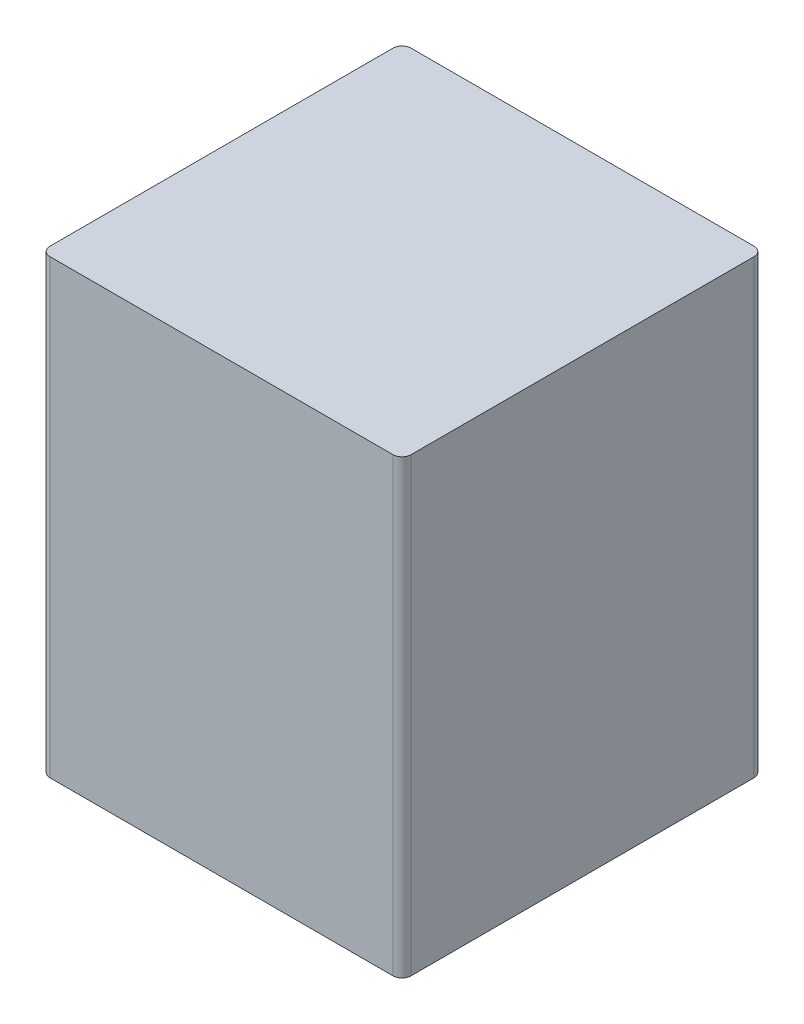
ISO-10303-21;
HEADER;
FILE_DESCRIPTION(('STEP AP214'),'2;1');
FILE_NAME('part.step','',(''),(''),'','','');
FILE_SCHEMA(('AUTOMOTIVE_DESIGN { 1 0 10303 214 1 1 1 1 }'));
ENDSEC;
DATA;
#1=APPLICATION_CONTEXT('core data for automotive mechanical design processes');
#2=APPLICATION_PROTOCOL_DEFINITION('international standard','automotive_design',2000,#1);
#3=PRODUCT_CONTEXT('',#1,'mechanical');
#4=PRODUCT('Part','Part','',(#3));
#5=PRODUCT_RELATED_PRODUCT_CATEGORY('part','',(#4));
#6=PRODUCT_DEFINITION_FORMATION('','',#4);
#7=PRODUCT_DEFINITION_CONTEXT('part definition',#1,'design');
#8=PRODUCT_DEFINITION('design','',#6,#7);
#9=PRODUCT_DEFINITION_SHAPE('','',#8);
#10=(LENGTH_UNIT() NAMED_UNIT(*) SI_UNIT(.MILLI.,.METRE.));
#11=(NAMED_UNIT(*) PLANE_ANGLE_UNIT() SI_UNIT($,.RADIAN.));
#12=(NAMED_UNIT(*) SI_UNIT($,.STERADIAN.) SOLID_ANGLE_UNIT());
#13=UNCERTAINTY_MEASURE_WITH_UNIT(LENGTH_MEASURE(1.E-05),#10,'distance_accuracy_value','');
#14=(GEOMETRIC_REPRESENTATION_CONTEXT(3) GLOBAL_UNCERTAINTY_ASSIGNED_CONTEXT((#13)) GLOBAL_UNIT_ASSIGNED_CONTEXT((#10,
#11,#12)) REPRESENTATION_CONTEXT('',''));
#15=CARTESIAN_POINT('',(0.,0.,0.));
#16=DIRECTION('',(0.,0.,1.));
#17=DIRECTION('',(1.,0.,0.));
#18=AXIS2_PLACEMENT_3D('',#15,#16,#17);
#19=CARTESIAN_POINT('',(11.4142330001026,68.8538549999221,-0.0200000060000001));
#20=DIRECTION('',(-2.05103367282991E-10,1.,0.));
#21=DIRECTION('',(-1.,-2.05103367282991E-10,0.));
#22=AXIS2_PLACEMENT_3D('',#19,#20,#21);
#23=CYLINDRICAL_SURFACE('',#22,0.02);
#24=CARTESIAN_POINT('',(11.4142329998975,69.8538549999221,-0.0200000060000001));
#25=DIRECTION('',(-2.05103367282991E-10,1.,0.));
#26=DIRECTION('',(-1.,-2.05103367282991E-10,0.));
#27=AXIS2_PLACEMENT_3D('',#24,#25,#26);
#28=CIRCLE('',#27,0.02);
#29=CARTESIAN_POINT('',(11.414233,69.8538549999221,-6.00000000643917E-09));
#30=VERTEX_POINT('',#29);
#31=CARTESIAN_POINT('',(11.3942329998974,69.853854999918,-0.0200000060000001));
#32=VERTEX_POINT('',#31);
#33=EDGE_CURVE('E113',#30,#32,#28,.F.);
#34=ORIENTED_EDGE('',*,*,#33,.T.);
#35=DIRECTION('',(-2.05103367282991E-10,1.,0.));
#36=VECTOR('',#35,1.);
#37=CARTESIAN_POINT('',(11.3942330001026,68.853854999918,-0.0200000060000001));
#38=LINE('',#37,#36);
#39=CARTESIAN_POINT('',(11.3942330001026,68.853854999918,-0.0200000060000001));
#40=VERTEX_POINT('',#39);
#41=EDGE_CURVE('E117',#32,#40,#38,.F.);
#42=ORIENTED_EDGE('',*,*,#41,.T.);
#43=CARTESIAN_POINT('',(11.4142330001026,68.8538549999221,-0.0200000060000001));
#44=DIRECTION('',(-2.05103367282991E-10,1.,0.));
#45=DIRECTION('',(-1.,-2.05103367282991E-10,0.));
#46=AXIS2_PLACEMENT_3D('',#43,#44,#45);
#47=CIRCLE('',#46,0.02);
#48=CARTESIAN_POINT('',(11.4142330001026,68.8538549999221,-6.00000007254734E-09));
#49=VERTEX_POINT('',#48);
#50=EDGE_CURVE('E127',#40,#49,#47,.T.);
#51=ORIENTED_EDGE('',*,*,#50,.T.);
#52=DIRECTION('',(0.,1.,0.));
#53=VECTOR('',#52,1.);
#54=CARTESIAN_POINT('',(11.4142330001026,68.853855000082,-6.00000003685316E-09));
#55=LINE('',#54,#53);
#56=EDGE_CURVE('E123',#49,#30,#55,.T.);
#57=ORIENTED_EDGE('',*,*,#56,.T.);
#58=EDGE_LOOP('',(#34,#42,#51,#57));
#59=FACE_BOUND('',#58,.T.);
#60=ADVANCED_FACE('F17',(#59),#23,.T.);
#61=CARTESIAN_POINT('',(12.1942330001026,68.853855000082,-5.99999994133071E-09));
#62=DIRECTION('',(0.,0.,-1.));
#63=DIRECTION('',(-1.,0.,0.));
#64=AXIS2_PLACEMENT_3D('',#61,#62,#63);
#65=PLANE('',#64);
#66=DIRECTION('',(2.05103367282991E-10,-1.,0.));
#67=VECTOR('',#66,1.);
#68=CARTESIAN_POINT('',(12.1742329998974,69.8538550000779,-5.99999999974211E-09));
#69=LINE('',#68,#67);
#70=CARTESIAN_POINT('',(12.1742329998974,69.8538550000779,-5.99999999381288E-09));
#71=VERTEX_POINT('',#70);
#72=CARTESIAN_POINT('',(12.1742330001025,68.8538550000779,-6.00000004209375E-09));
#73=VERTEX_POINT('',#72);
#74=EDGE_CURVE('E88',#71,#73,#69,.T.);
#75=ORIENTED_EDGE('',*,*,#74,.F.);
#76=DIRECTION('',(1.,2.05103367282991E-10,0.));
#77=VECTOR('',#76,1.);
#78=CARTESIAN_POINT('',(11.3942329998974,69.853854999918,-5.99999997602518E-09));
#79=LINE('',#78,#77);
#80=EDGE_CURVE('E85',#71,#30,#79,.F.);
#81=ORIENTED_EDGE('',*,*,#80,.T.);
#82=ORIENTED_EDGE('',*,*,#56,.F.);
#83=DIRECTION('',(-1.,-2.05103367282991E-10,0.));
#84=VECTOR('',#83,1.);
#85=CARTESIAN_POINT('',(12.1942330001026,68.853855000082,-6.0000000844454E-09));
#86=LINE('',#85,#84);
#87=EDGE_CURVE('E135',#49,#73,#86,.F.);
#88=ORIENTED_EDGE('',*,*,#87,.T.);
#89=EDGE_LOOP('',(#75,#81,#82,#88));
#90=FACE_BOUND('',#89,.T.);
#91=ADVANCED_FACE('F145',(#90),#65,.F.);
#92=CARTESIAN_POINT('',(12.1942330001026,68.853855000082,-0.800000006));
#93=DIRECTION('',(0.,0.,-1.));
#94=DIRECTION('',(-1.,0.,0.));
#95=AXIS2_PLACEMENT_3D('',#92,#93,#94);
#96=PLANE('',#95);
#97=DIRECTION('',(1.,2.05103367282991E-10,0.));
#98=VECTOR('',#97,1.);
#99=CARTESIAN_POINT('',(11.3942329998974,69.853854999918,-0.800000006));
#100=LINE('',#99,#98);
#101=CARTESIAN_POINT('',(11.4142329998974,69.8538549999221,-0.800000006));
#102=VERTEX_POINT('',#101);
#103=CARTESIAN_POINT('',(12.1742329998975,69.8538550000779,-0.800000006));
#104=VERTEX_POINT('',#103);
#105=EDGE_CURVE('E106',#102,#104,#100,.T.);
#106=ORIENTED_EDGE('',*,*,#105,.T.);
#107=DIRECTION('',(-2.05103367282991E-10,1.,0.));
#108=VECTOR('',#107,1.);
#109=CARTESIAN_POINT('',(12.1742330001026,68.8538550000779,-0.800000006));
#110=LINE('',#109,#108);
#111=CARTESIAN_POINT('',(12.1742330001026,68.8538550000779,-0.800000006));
#112=VERTEX_POINT('',#111);
#113=EDGE_CURVE('E124',#112,#104,#110,.T.);
#114=ORIENTED_EDGE('',*,*,#113,.F.);
#115=DIRECTION('',(-1.,-2.05103367282991E-10,0.));
#116=VECTOR('',#115,1.);
#117=CARTESIAN_POINT('',(12.1942330001026,68.853855000082,-0.800000006));
#118=LINE('',#117,#116);
#119=CARTESIAN_POINT('',(11.4142330001026,68.8538549999221,-0.800000006));
#120=VERTEX_POINT('',#119);
#121=EDGE_CURVE('E132',#112,#120,#118,.T.);
#122=ORIENTED_EDGE('',*,*,#121,.T.);
#123=DIRECTION('',(2.05103367282991E-10,-1.,0.));
#124=VECTOR('',#123,1.);
#125=CARTESIAN_POINT('',(11.4142330001025,68.8538549999221,-0.800000006));
#126=LINE('',#125,#124);
#127=EDGE_CURVE('E120',#102,#120,#126,.T.);
#128=ORIENTED_EDGE('',*,*,#127,.F.);
#129=EDGE_LOOP('',(#106,#114,#122,#128));
#130=FACE_BOUND('',#129,.T.);
#131=ADVANCED_FACE('F156',(#130),#96,.T.);
#132=CARTESIAN_POINT('',(11.4142330001026,68.8538549999221,-0.780000006));
#133=DIRECTION('',(2.05103367282991E-10,-1.,0.));
#134=DIRECTION('',(1.,2.05103367282991E-10,0.));
#135=AXIS2_PLACEMENT_3D('',#132,#133,#134);
#136=CYLINDRICAL_SURFACE('',#135,0.02);
#137=CARTESIAN_POINT('',(11.4142329998975,69.8538549999221,-0.780000006));
#138=DIRECTION('',(2.05103367282991E-10,-1.,0.));
#139=DIRECTION('',(1.,2.05103367282991E-10,0.));
#140=AXIS2_PLACEMENT_3D('',#137,#138,#139);
#141=CIRCLE('',#140,0.02);
#142=CARTESIAN_POINT('',(11.3942329998974,69.853854999918,-0.780000006));
#143=VERTEX_POINT('',#142);
#144=EDGE_CURVE('E109',#143,#102,#141,.T.);
#145=ORIENTED_EDGE('',*,*,#144,.T.);
#146=ORIENTED_EDGE('',*,*,#127,.T.);
#147=CARTESIAN_POINT('',(11.4142330001026,68.8538549999221,-0.780000006));
#148=DIRECTION('',(2.05103367282991E-10,-1.,0.));
#149=DIRECTION('',(1.,2.05103367282991E-10,0.));
#150=AXIS2_PLACEMENT_3D('',#147,#148,#149);
#151=CIRCLE('',#150,0.02);
#152=CARTESIAN_POINT('',(11.3942330001026,68.853854999918,-0.780000006));
#153=VERTEX_POINT('',#152);
#154=EDGE_CURVE('E102',#120,#153,#151,.F.);
#155=ORIENTED_EDGE('',*,*,#154,.T.);
#156=DIRECTION('',(-2.05103367282991E-10,1.,0.));
#157=VECTOR('',#156,1.);
#158=CARTESIAN_POINT('',(11.3942330001026,68.853854999918,-0.780000006));
#159=LINE('',#158,#157);
#160=EDGE_CURVE('E115',#153,#143,#159,.T.);
#161=ORIENTED_EDGE('',*,*,#160,.T.);
#162=EDGE_LOOP('',(#145,#146,#155,#161));
#163=FACE_BOUND('',#162,.T.);
#164=ADVANCED_FACE('F160',(#163),#136,.T.);
#165=CARTESIAN_POINT('',(11.3942330001026,68.853854999918,-0.800000006));
#166=DIRECTION('',(1.,2.05103367282991E-10,0.));
#167=DIRECTION('',(-2.05103367282991E-10,1.,0.));
#168=AXIS2_PLACEMENT_3D('',#165,#166,#167);
#169=PLANE('',#168);
#170=ORIENTED_EDGE('',*,*,#160,.F.);
#171=DIRECTION('',(0.,0.,1.));
#172=VECTOR('',#171,1.);
#173=CARTESIAN_POINT('',(11.3942330001026,68.8538549999179,-0.800000006));
#174=LINE('',#173,#172);
#175=EDGE_CURVE('E99',#153,#40,#174,.T.);
#176=ORIENTED_EDGE('',*,*,#175,.T.);
#177=ORIENTED_EDGE('',*,*,#41,.F.);
#178=DIRECTION('',(0.,0.,1.));
#179=VECTOR('',#178,1.);
#180=CARTESIAN_POINT('',(11.3942329998974,69.853854999918,-0.800000006));
#181=LINE('',#180,#179);
#182=EDGE_CURVE('E110',#32,#143,#181,.F.);
#183=ORIENTED_EDGE('',*,*,#182,.T.);
#184=EDGE_LOOP('',(#170,#176,#177,#183));
#185=FACE_BOUND('',#184,.T.);
#186=ADVANCED_FACE('F163',(#185),#169,.F.);
#187=CARTESIAN_POINT('',(12.1742329998974,69.8538550000779,-0.020000006));
#188=DIRECTION('',(2.05103367282991E-10,-1.,0.));
#189=DIRECTION('',(1.,2.05103367282991E-10,0.));
#190=AXIS2_PLACEMENT_3D('',#187,#188,#189);
#191=CYLINDRICAL_SURFACE('',#190,0.02);
#192=CARTESIAN_POINT('',(12.1742330001025,68.8538550000779,-0.020000006));
#193=DIRECTION('',(2.05103367282991E-10,-1.,0.));
#194=DIRECTION('',(1.,2.05103367282991E-10,0.));
#195=AXIS2_PLACEMENT_3D('',#192,#193,#194);
#196=CIRCLE('',#195,0.02);
#197=CARTESIAN_POINT('',(12.1942330001025,68.853855000082,-0.020000006));
#198=VERTEX_POINT('',#197);
#199=EDGE_CURVE('E98',#73,#198,#196,.F.);
#200=ORIENTED_EDGE('',*,*,#199,.T.);
#201=DIRECTION('',(2.05103367282991E-10,-1.,0.));
#202=VECTOR('',#201,1.);
#203=CARTESIAN_POINT('',(12.1942329998974,69.853855000082,-0.020000006));
#204=LINE('',#203,#202);
#205=CARTESIAN_POINT('',(12.1942329998974,69.853855000082,-0.020000006));
#206=VERTEX_POINT('',#205);
#207=EDGE_CURVE('E92',#198,#206,#204,.F.);
#208=ORIENTED_EDGE('',*,*,#207,.T.);
#209=CARTESIAN_POINT('',(12.1742329998974,69.8538550000779,-0.020000006));
#210=DIRECTION('',(2.05103367282991E-10,-1.,0.));
#211=DIRECTION('',(1.,2.05103367282991E-10,0.));
#212=AXIS2_PLACEMENT_3D('',#209,#210,#211);
#213=CIRCLE('',#212,0.02);
#214=EDGE_CURVE('E20',#206,#71,#213,.T.);
#215=ORIENTED_EDGE('',*,*,#214,.T.);
#216=ORIENTED_EDGE('',*,*,#74,.T.);
#217=EDGE_LOOP('',(#200,#208,#215,#216));
#218=FACE_BOUND('',#217,.T.);
#219=ADVANCED_FACE('F96',(#218),#191,.T.);
#220=CARTESIAN_POINT('',(11.3942329998974,69.853854999918,-0.800000006));
#221=DIRECTION('',(2.05103367282991E-10,-1.,0.));
#222=DIRECTION('',(1.,2.05103367282991E-10,0.));
#223=AXIS2_PLACEMENT_3D('',#220,#221,#222);
#224=PLANE('',#223);
#225=ORIENTED_EDGE('',*,*,#144,.F.);
#226=ORIENTED_EDGE('',*,*,#182,.F.);
#227=ORIENTED_EDGE('',*,*,#33,.F.);
#228=ORIENTED_EDGE('',*,*,#80,.F.);
#229=ORIENTED_EDGE('',*,*,#214,.F.);
#230=DIRECTION('',(0.,0.,1.));
#231=VECTOR('',#230,1.);
#232=CARTESIAN_POINT('',(12.1942329998974,69.853855000082,-0.800000006));
#233=LINE('',#232,#231);
#234=CARTESIAN_POINT('',(12.1942329998974,69.853855000082,-0.780000006));
#235=VERTEX_POINT('',#234);
#236=EDGE_CURVE('E82',#206,#235,#233,.F.);
#237=ORIENTED_EDGE('',*,*,#236,.T.);
#238=CARTESIAN_POINT('',(12.1742329998975,69.8538550000779,-0.780000006));
#239=DIRECTION('',(-2.05103367282991E-10,1.,0.));
#240=DIRECTION('',(-1.,-2.05103367282991E-10,0.));
#241=AXIS2_PLACEMENT_3D('',#238,#239,#240);
#242=CIRCLE('',#241,0.02);
#243=EDGE_CURVE('E108',#104,#235,#242,.F.);
#244=ORIENTED_EDGE('',*,*,#243,.F.);
#245=ORIENTED_EDGE('',*,*,#105,.F.);
#246=EDGE_LOOP('',(#225,#226,#227,#228,#229,#237,#244,#245));
#247=FACE_BOUND('',#246,.T.);
#248=ADVANCED_FACE('F80',(#247),#224,.F.);
#249=CARTESIAN_POINT('',(12.1742330001026,68.8538550000779,-0.780000006));
#250=DIRECTION('',(-2.05103367282991E-10,1.,0.));
#251=DIRECTION('',(-1.,-2.05103367282991E-10,0.));
#252=AXIS2_PLACEMENT_3D('',#249,#250,#251);
#253=CYLINDRICAL_SURFACE('',#252,0.02);
#254=CARTESIAN_POINT('',(12.1742330001026,68.8538550000779,-0.780000006));
#255=DIRECTION('',(-2.05103367282991E-10,1.,0.));
#256=DIRECTION('',(-1.,-2.05103367282991E-10,0.));
#257=AXIS2_PLACEMENT_3D('',#254,#255,#256);
#258=CIRCLE('',#257,0.02);
#259=CARTESIAN_POINT('',(12.1942330001025,68.853855000082,-0.780000006));
#260=VERTEX_POINT('',#259);
#261=EDGE_CURVE('E34',#260,#112,#258,.T.);
#262=ORIENTED_EDGE('',*,*,#261,.T.);
#263=ORIENTED_EDGE('',*,*,#113,.T.);
#264=ORIENTED_EDGE('',*,*,#243,.T.);
#265=DIRECTION('',(2.05103367282991E-10,-1.,0.));
#266=VECTOR('',#265,1.);
#267=CARTESIAN_POINT('',(12.1942329998974,69.853855000082,-0.780000006));
#268=LINE('',#267,#266);
#269=EDGE_CURVE('E26',#235,#260,#268,.T.);
#270=ORIENTED_EDGE('',*,*,#269,.T.);
#271=EDGE_LOOP('',(#262,#263,#264,#270));
#272=FACE_BOUND('',#271,.T.);
#273=ADVANCED_FACE('F151',(#272),#253,.T.);
#274=CARTESIAN_POINT('',(12.1942330001026,68.853855000082,-0.800000006));
#275=DIRECTION('',(-2.05103367282991E-10,1.,0.));
#276=DIRECTION('',(-1.,-2.05103367282991E-10,0.));
#277=AXIS2_PLACEMENT_3D('',#274,#275,#276);
#278=PLANE('',#277);
#279=ORIENTED_EDGE('',*,*,#154,.F.);
#280=ORIENTED_EDGE('',*,*,#121,.F.);
#281=ORIENTED_EDGE('',*,*,#261,.F.);
#282=DIRECTION('',(0.,0.,1.));
#283=VECTOR('',#282,1.);
#284=CARTESIAN_POINT('',(12.1942330001025,68.853855000082,-0.800000006));
#285=LINE('',#284,#283);
#286=EDGE_CURVE('E11',#260,#198,#285,.T.);
#287=ORIENTED_EDGE('',*,*,#286,.T.);
#288=ORIENTED_EDGE('',*,*,#199,.F.);
#289=ORIENTED_EDGE('',*,*,#87,.F.);
#290=ORIENTED_EDGE('',*,*,#50,.F.);
#291=ORIENTED_EDGE('',*,*,#175,.F.);
#292=EDGE_LOOP('',(#279,#280,#281,#287,#288,#289,#290,#291));
#293=FACE_BOUND('',#292,.T.);
#294=ADVANCED_FACE('F149',(#293),#278,.F.);
#295=CARTESIAN_POINT('',(12.1942329998974,69.853855000082,-0.800000006));
#296=DIRECTION('',(-1.,-2.05103367282991E-10,0.));
#297=DIRECTION('',(2.05103367282991E-10,-1.,0.));
#298=AXIS2_PLACEMENT_3D('',#295,#296,#297);
#299=PLANE('',#298);
#300=ORIENTED_EDGE('',*,*,#269,.F.);
#301=ORIENTED_EDGE('',*,*,#236,.F.);
#302=ORIENTED_EDGE('',*,*,#207,.F.);
#303=ORIENTED_EDGE('',*,*,#286,.F.);
#304=EDGE_LOOP('',(#300,#301,#302,#303));
#305=FACE_BOUND('',#304,.T.);
#306=ADVANCED_FACE('F91',(#305),#299,.F.);
#307=CLOSED_SHELL('',(#60,#91,#131,#164,#186,#219,#248,#273,#294,#306));
#308=MANIFOLD_SOLID_BREP('B1',#307);
#309=ADVANCED_BREP_SHAPE_REPRESENTATION('',(#18,#308),#14);
#310=SHAPE_DEFINITION_REPRESENTATION(#9,#309);
ENDSEC;
END-ISO-10303-21;
